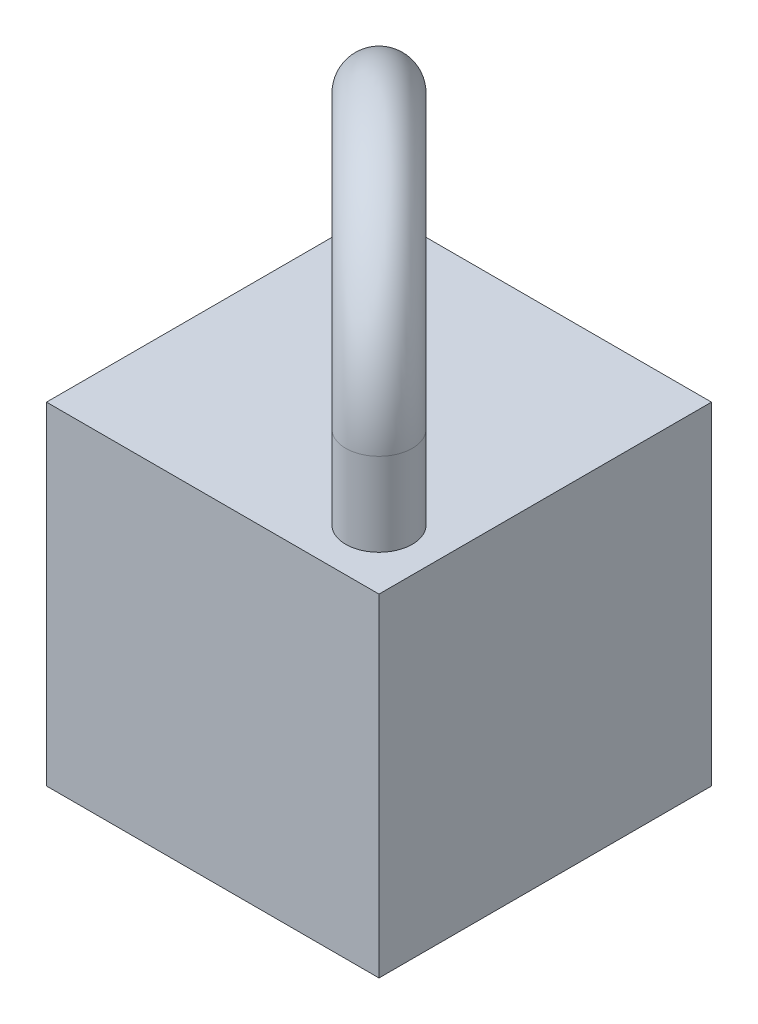
ISO-10303-21;
HEADER;
FILE_DESCRIPTION(('STEP AP214'),'2;1');
FILE_NAME('part.step','',(''),(''),'','','');
FILE_SCHEMA(('AUTOMOTIVE_DESIGN { 1 0 10303 214 1 1 1 1 }'));
ENDSEC;
DATA;
#1=APPLICATION_CONTEXT('core data for automotive mechanical design processes');
#2=APPLICATION_PROTOCOL_DEFINITION('international standard','automotive_design',2000,#1);
#3=PRODUCT_CONTEXT('',#1,'mechanical');
#4=PRODUCT('Part','Part','',(#3));
#5=PRODUCT_RELATED_PRODUCT_CATEGORY('part','',(#4));
#6=PRODUCT_DEFINITION_FORMATION('','',#4);
#7=PRODUCT_DEFINITION_CONTEXT('part definition',#1,'design');
#8=PRODUCT_DEFINITION('design','',#6,#7);
#9=PRODUCT_DEFINITION_SHAPE('','',#8);
#10=(LENGTH_UNIT() NAMED_UNIT(*) SI_UNIT(.MILLI.,.METRE.));
#11=(NAMED_UNIT(*) PLANE_ANGLE_UNIT() SI_UNIT($,.RADIAN.));
#12=(NAMED_UNIT(*) SI_UNIT($,.STERADIAN.) SOLID_ANGLE_UNIT());
#13=UNCERTAINTY_MEASURE_WITH_UNIT(LENGTH_MEASURE(1.E-05),#10,'distance_accuracy_value','');
#14=(GEOMETRIC_REPRESENTATION_CONTEXT(3) GLOBAL_UNCERTAINTY_ASSIGNED_CONTEXT((#13)) GLOBAL_UNIT_ASSIGNED_CONTEXT((#10,
#11,#12)) REPRESENTATION_CONTEXT('',''));
#15=CARTESIAN_POINT('',(0.,0.,0.));
#16=DIRECTION('',(0.,0.,1.));
#17=DIRECTION('',(1.,0.,0.));
#18=AXIS2_PLACEMENT_3D('',#15,#16,#17);
#19=CARTESIAN_POINT('',(12.7,12.7,12.7));
#20=DIRECTION('',(-1.,0.,0.));
#21=DIRECTION('',(0.,0.,1.));
#22=AXIS2_PLACEMENT_3D('',#19,#20,#21);
#23=PLANE('',#22);
#24=DIRECTION('',(0.,0.,-1.));
#25=VECTOR('',#24,1.);
#26=CARTESIAN_POINT('',(12.7,-12.7,12.7));
#27=LINE('',#26,#25);
#28=CARTESIAN_POINT('',(12.7,-12.7,12.7));
#29=VERTEX_POINT('',#28);
#30=CARTESIAN_POINT('',(12.7,-12.7,-12.7));
#31=VERTEX_POINT('',#30);
#32=EDGE_CURVE('E109',#29,#31,#27,.T.);
#33=ORIENTED_EDGE('',*,*,#32,.T.);
#34=DIRECTION('',(0.,-1.,0.));
#35=VECTOR('',#34,1.);
#36=CARTESIAN_POINT('',(12.7,12.7,-12.7));
#37=LINE('',#36,#35);
#38=CARTESIAN_POINT('',(12.7,12.7,-12.7));
#39=VERTEX_POINT('',#38);
#40=EDGE_CURVE('E11',#39,#31,#37,.T.);
#41=ORIENTED_EDGE('',*,*,#40,.F.);
#42=DIRECTION('',(0.,0.,-1.));
#43=VECTOR('',#42,1.);
#44=CARTESIAN_POINT('',(12.7,12.7,12.7));
#45=LINE('',#44,#43);
#46=CARTESIAN_POINT('',(12.7,12.7,12.7));
#47=VERTEX_POINT('',#46);
#48=EDGE_CURVE('E93',#47,#39,#45,.T.);
#49=ORIENTED_EDGE('',*,*,#48,.F.);
#50=DIRECTION('',(0.,-1.,0.));
#51=VECTOR('',#50,1.);
#52=CARTESIAN_POINT('',(12.7,12.7,12.7));
#53=LINE('',#52,#51);
#54=EDGE_CURVE('E105',#47,#29,#53,.T.);
#55=ORIENTED_EDGE('',*,*,#54,.T.);
#56=EDGE_LOOP('',(#33,#41,#49,#55));
#57=FACE_BOUND('',#56,.T.);
#58=ADVANCED_FACE('F41',(#57),#23,.F.);
#59=CARTESIAN_POINT('',(-12.7,12.7,-12.7));
#60=DIRECTION('',(0.,0.,1.));
#61=DIRECTION('',(1.,0.,0.));
#62=AXIS2_PLACEMENT_3D('',#59,#60,#61);
#63=PLANE('',#62);
#64=DIRECTION('',(-1.,0.,0.));
#65=VECTOR('',#64,1.);
#66=CARTESIAN_POINT('',(-12.7,-12.7,-12.7));
#67=LINE('',#66,#65);
#68=CARTESIAN_POINT('',(-12.7,-12.7,-12.7));
#69=VERTEX_POINT('',#68);
#70=EDGE_CURVE('E98',#31,#69,#67,.T.);
#71=ORIENTED_EDGE('',*,*,#70,.T.);
#72=DIRECTION('',(0.,-1.,0.));
#73=VECTOR('',#72,1.);
#74=CARTESIAN_POINT('',(-12.7,12.7,-12.7));
#75=LINE('',#74,#73);
#76=CARTESIAN_POINT('',(-12.7,12.7,-12.7));
#77=VERTEX_POINT('',#76);
#78=EDGE_CURVE('E50',#77,#69,#75,.T.);
#79=ORIENTED_EDGE('',*,*,#78,.F.);
#80=DIRECTION('',(-1.,0.,0.));
#81=VECTOR('',#80,1.);
#82=CARTESIAN_POINT('',(-12.7,12.7,-12.7));
#83=LINE('',#82,#81);
#84=EDGE_CURVE('E88',#39,#77,#83,.T.);
#85=ORIENTED_EDGE('',*,*,#84,.F.);
#86=ORIENTED_EDGE('',*,*,#40,.T.);
#87=EDGE_LOOP('',(#71,#79,#85,#86));
#88=FACE_BOUND('',#87,.T.);
#89=ADVANCED_FACE('F97',(#88),#63,.F.);
#90=CARTESIAN_POINT('',(-12.7,12.7,12.7));
#91=DIRECTION('',(1.,0.,0.));
#92=DIRECTION('',(0.,0.,-1.));
#93=AXIS2_PLACEMENT_3D('',#90,#91,#92);
#94=PLANE('',#93);
#95=DIRECTION('',(0.,0.,1.));
#96=VECTOR('',#95,1.);
#97=CARTESIAN_POINT('',(-12.7,-12.7,12.7));
#98=LINE('',#97,#96);
#99=CARTESIAN_POINT('',(-12.7,-12.7,12.7));
#100=VERTEX_POINT('',#99);
#101=EDGE_CURVE('E75',#69,#100,#98,.T.);
#102=ORIENTED_EDGE('',*,*,#101,.T.);
#103=DIRECTION('',(0.,-1.,0.));
#104=VECTOR('',#103,1.);
#105=CARTESIAN_POINT('',(-12.7,12.7,12.7));
#106=LINE('',#105,#104);
#107=CARTESIAN_POINT('',(-12.7,12.7,12.7));
#108=VERTEX_POINT('',#107);
#109=EDGE_CURVE('E100',#108,#100,#106,.T.);
#110=ORIENTED_EDGE('',*,*,#109,.F.);
#111=DIRECTION('',(0.,0.,1.));
#112=VECTOR('',#111,1.);
#113=CARTESIAN_POINT('',(-12.7,12.7,12.7));
#114=LINE('',#113,#112);
#115=EDGE_CURVE('E91',#77,#108,#114,.T.);
#116=ORIENTED_EDGE('',*,*,#115,.F.);
#117=ORIENTED_EDGE('',*,*,#78,.T.);
#118=EDGE_LOOP('',(#102,#110,#116,#117));
#119=FACE_BOUND('',#118,.T.);
#120=ADVANCED_FACE('F101',(#119),#94,.F.);
#121=CARTESIAN_POINT('',(-12.7,12.7,12.7));
#122=DIRECTION('',(0.,0.,-1.));
#123=DIRECTION('',(-1.,0.,0.));
#124=AXIS2_PLACEMENT_3D('',#121,#122,#123);
#125=PLANE('',#124);
#126=DIRECTION('',(1.,0.,0.));
#127=VECTOR('',#126,1.);
#128=CARTESIAN_POINT('',(-12.7,-12.7,12.7));
#129=LINE('',#128,#127);
#130=EDGE_CURVE('E81',#100,#29,#129,.T.);
#131=ORIENTED_EDGE('',*,*,#130,.T.);
#132=ORIENTED_EDGE('',*,*,#54,.F.);
#133=DIRECTION('',(1.,0.,0.));
#134=VECTOR('',#133,1.);
#135=CARTESIAN_POINT('',(-12.7,12.7,12.7));
#136=LINE('',#135,#134);
#137=EDGE_CURVE('E58',#108,#47,#136,.T.);
#138=ORIENTED_EDGE('',*,*,#137,.F.);
#139=ORIENTED_EDGE('',*,*,#109,.T.);
#140=EDGE_LOOP('',(#131,#132,#138,#139));
#141=FACE_BOUND('',#140,.T.);
#142=ADVANCED_FACE('F123',(#141),#125,.F.);
#143=CARTESIAN_POINT('',(0.,12.7,0.));
#144=DIRECTION('',(0.,-1.,0.));
#145=DIRECTION('',(0.,0.,-1.));
#146=AXIS2_PLACEMENT_3D('',#143,#144,#145);
#147=PLANE('',#146);
#148=CARTESIAN_POINT('',(-8.14109582480207,12.7,-8.14109582480204));
#149=DIRECTION('',(0.,-1.,0.));
#150=DIRECTION('',(0.,0.,-1.));
#151=AXIS2_PLACEMENT_3D('',#148,#149,#150);
#152=CIRCLE('',#151,2.54);
#153=CARTESIAN_POINT('',(-8.14109582480207,12.7,-10.681095824802));
#154=VERTEX_POINT('',#153);
#155=EDGE_CURVE('E141',#154,#154,#152,.F.);
#156=ORIENTED_EDGE('',*,*,#155,.F.);
#157=EDGE_LOOP('',(#156));
#158=FACE_BOUND('',#157,.T.);
#159=CARTESIAN_POINT('',(8.14109582480207,12.7,8.14109582480204));
#160=DIRECTION('',(0.,-1.,0.));
#161=DIRECTION('',(0.,0.,-1.));
#162=AXIS2_PLACEMENT_3D('',#159,#160,#161);
#163=CIRCLE('',#162,2.54);
#164=CARTESIAN_POINT('',(8.14109582480207,12.7,5.60109582480204));
#165=VERTEX_POINT('',#164);
#166=EDGE_CURVE('E133',#165,#165,#163,.F.);
#167=ORIENTED_EDGE('',*,*,#166,.F.);
#168=EDGE_LOOP('',(#167));
#169=FACE_BOUND('',#168,.T.);
#170=ORIENTED_EDGE('',*,*,#48,.T.);
#171=ORIENTED_EDGE('',*,*,#84,.T.);
#172=ORIENTED_EDGE('',*,*,#115,.T.);
#173=ORIENTED_EDGE('',*,*,#137,.T.);
#174=EDGE_LOOP('',(#170,#171,#172,#173));
#175=FACE_BOUND('',#174,.T.);
#176=ADVANCED_FACE('F89',(#158,#169,#175),#147,.F.);
#177=CARTESIAN_POINT('',(0.,-12.7,0.));
#178=DIRECTION('',(0.,-1.,0.));
#179=DIRECTION('',(0.,0.,-1.));
#180=AXIS2_PLACEMENT_3D('',#177,#178,#179);
#181=PLANE('',#180);
#182=ORIENTED_EDGE('',*,*,#32,.F.);
#183=ORIENTED_EDGE('',*,*,#130,.F.);
#184=ORIENTED_EDGE('',*,*,#101,.F.);
#185=ORIENTED_EDGE('',*,*,#70,.F.);
#186=EDGE_LOOP('',(#182,#183,#184,#185));
#187=FACE_BOUND('',#186,.T.);
#188=ADVANCED_FACE('F126',(#187),#181,.T.);
#189=CARTESIAN_POINT('',(8.14109582480207,-12.702,8.14109582480204));
#190=DIRECTION('',(0.,1.,0.));
#191=DIRECTION('',(0.,0.,1.));
#192=AXIS2_PLACEMENT_3D('',#189,#190,#191);
#193=CYLINDRICAL_SURFACE('',#192,2.54);
#194=CARTESIAN_POINT('',(8.14109582480207,19.05,8.14109582480204));
#195=DIRECTION('',(0.,1.,0.));
#196=DIRECTION('',(0.,0.,1.));
#197=AXIS2_PLACEMENT_3D('',#194,#195,#196);
#198=CIRCLE('',#197,2.54);
#199=CARTESIAN_POINT('',(9.9371470490159,19.05,9.93714704901587));
#200=VERTEX_POINT('',#199);
#201=EDGE_CURVE('E113',#200,#200,#198,.T.);
#202=ORIENTED_EDGE('',*,*,#201,.F.);
#203=EDGE_LOOP('',(#202));
#204=FACE_BOUND('',#203,.T.);
#205=ORIENTED_EDGE('',*,*,#166,.T.);
#206=EDGE_LOOP('',(#205));
#207=FACE_BOUND('',#206,.T.);
#208=ADVANCED_FACE('F153',(#204,#207),#193,.T.);
#209=CARTESIAN_POINT('',(0.,19.05,0.));
#210=DIRECTION('',(0.707106781186546,0.,-0.707106781186549));
#211=DIRECTION('',(-0.707106781186549,0.,-0.707106781186546));
#212=AXIS2_PLACEMENT_3D('',#209,#210,#211);
#213=TOROIDAL_SURFACE('',#212,11.513248128014,2.54);
#214=CARTESIAN_POINT('',(-8.14109582480207,19.0499999999999,-8.14109582480204));
#215=DIRECTION('',(0.,-1.,0.));
#216=DIRECTION('',(-1.,0.,0.));
#217=AXIS2_PLACEMENT_3D('',#214,#215,#216);
#218=CIRCLE('',#217,2.54);
#219=CARTESIAN_POINT('',(-9.9371470490159,19.0499999999999,-9.93714704901587));
#220=VERTEX_POINT('',#219);
#221=EDGE_CURVE('E137',#220,#220,#218,.T.);
#222=CARTESIAN_POINT('',(0.,19.05,0.));
#223=DIRECTION('',(0.707106781186546,0.,-0.707106781186549));
#224=DIRECTION('',(-0.707106781186549,0.,-0.707106781186546));
#225=AXIS2_PLACEMENT_3D('',#222,#223,#224);
#226=CIRCLE('',#225,14.053248128014);
#227=EDGE_CURVE('',#220,#200,#226,.T.);
#228=ORIENTED_EDGE('',*,*,#221,.F.);
#229=ORIENTED_EDGE('',*,*,#201,.T.);
#230=ORIENTED_EDGE('',*,*,#227,.T.);
#231=ORIENTED_EDGE('',*,*,#227,.F.);
#232=EDGE_LOOP('',(#228,#230,#229,#231));
#233=FACE_BOUND('',#232,.T.);
#234=ADVANCED_FACE('F155',(#233),#213,.T.);
#235=CARTESIAN_POINT('',(-8.14109582480207,-12.702,-8.14109582480204));
#236=DIRECTION('',(0.,1.,0.));
#237=DIRECTION('',(0.,0.,1.));
#238=AXIS2_PLACEMENT_3D('',#235,#236,#237);
#239=CYLINDRICAL_SURFACE('',#238,2.54);
#240=ORIENTED_EDGE('',*,*,#221,.T.);
#241=EDGE_LOOP('',(#240));
#242=FACE_BOUND('',#241,.T.);
#243=ORIENTED_EDGE('',*,*,#155,.T.);
#244=EDGE_LOOP('',(#243));
#245=FACE_BOUND('',#244,.T.);
#246=ADVANCED_FACE('F146',(#242,#245),#239,.T.);
#247=CLOSED_SHELL('',(#58,#89,#120,#142,#176,#188,#208,#234,#246));
#248=MANIFOLD_SOLID_BREP('B2',#247);
#249=ADVANCED_BREP_SHAPE_REPRESENTATION('',(#18,#248),#14);
#250=SHAPE_DEFINITION_REPRESENTATION(#9,#249);
ENDSEC;
END-ISO-10303-21;
